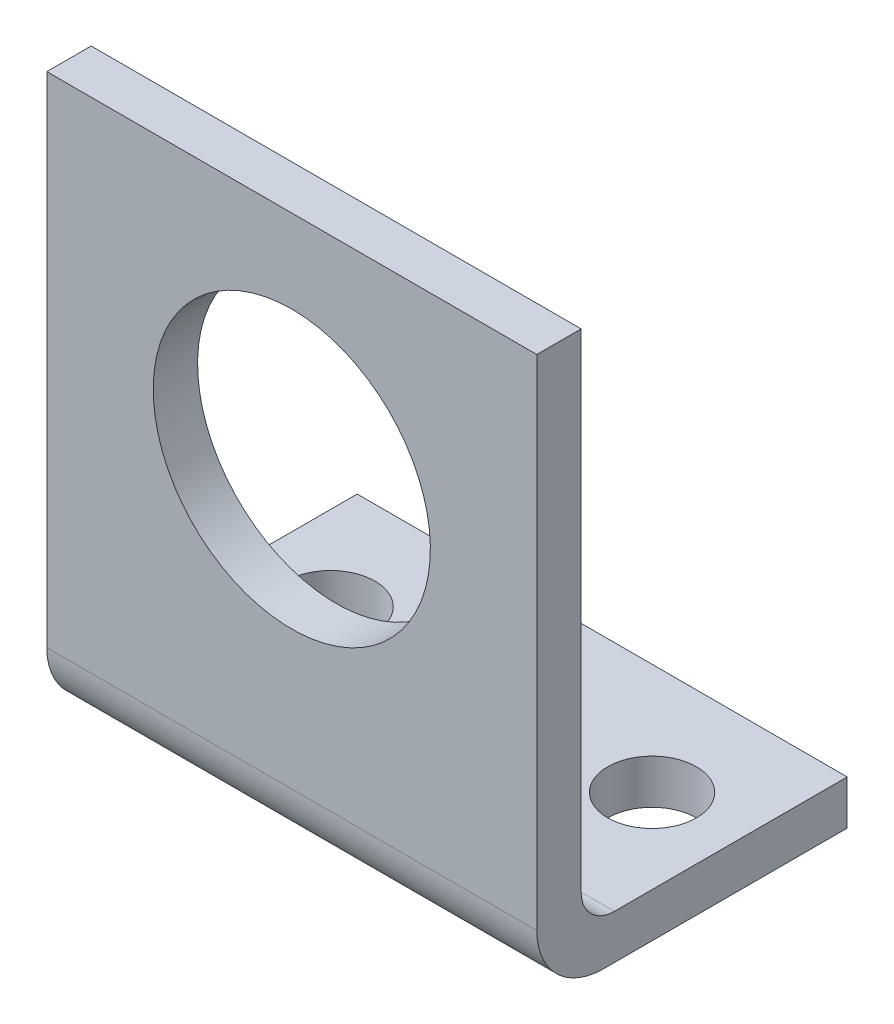
ISO-10303-21;
HEADER;
FILE_DESCRIPTION(('STEP AP214'),'2;1');
FILE_NAME('part.step','',(''),(''),'','','');
FILE_SCHEMA(('AUTOMOTIVE_DESIGN { 1 0 10303 214 1 1 1 1 }'));
ENDSEC;
DATA;
#1=APPLICATION_CONTEXT('core data for automotive mechanical design processes');
#2=APPLICATION_PROTOCOL_DEFINITION('international standard','automotive_design',2000,#1);
#3=PRODUCT_CONTEXT('',#1,'mechanical');
#4=PRODUCT('Part','Part','',(#3));
#5=PRODUCT_RELATED_PRODUCT_CATEGORY('part','',(#4));
#6=PRODUCT_DEFINITION_FORMATION('','',#4);
#7=PRODUCT_DEFINITION_CONTEXT('part definition',#1,'design');
#8=PRODUCT_DEFINITION('design','',#6,#7);
#9=PRODUCT_DEFINITION_SHAPE('','',#8);
#10=(LENGTH_UNIT() NAMED_UNIT(*) SI_UNIT(.MILLI.,.METRE.));
#11=(NAMED_UNIT(*) PLANE_ANGLE_UNIT() SI_UNIT($,.RADIAN.));
#12=(NAMED_UNIT(*) SI_UNIT($,.STERADIAN.) SOLID_ANGLE_UNIT());
#13=UNCERTAINTY_MEASURE_WITH_UNIT(LENGTH_MEASURE(1.E-05),#10,'distance_accuracy_value','');
#14=(GEOMETRIC_REPRESENTATION_CONTEXT(3) GLOBAL_UNCERTAINTY_ASSIGNED_CONTEXT((#13)) GLOBAL_UNIT_ASSIGNED_CONTEXT((#10,
#11,#12)) REPRESENTATION_CONTEXT('',''));
#15=CARTESIAN_POINT('',(0.,0.,0.));
#16=DIRECTION('',(0.,0.,1.));
#17=DIRECTION('',(1.,0.,0.));
#18=AXIS2_PLACEMENT_3D('',#15,#16,#17);
#19=CARTESIAN_POINT('',(22.1,25.5,0.));
#20=DIRECTION('',(0.,-1.,0.));
#21=DIRECTION('',(0.,0.,-1.));
#22=AXIS2_PLACEMENT_3D('',#19,#20,#21);
#23=PLANE('',#22);
#24=DIRECTION('',(0.,0.,1.));
#25=VECTOR('',#24,1.);
#26=CARTESIAN_POINT('',(0.,25.5,0.));
#27=LINE('',#26,#25);
#28=CARTESIAN_POINT('',(0.,25.5,-2.));
#29=VERTEX_POINT('',#28);
#30=CARTESIAN_POINT('',(0.,25.5,0.));
#31=VERTEX_POINT('',#30);
#32=EDGE_CURVE('E128',#29,#31,#27,.T.);
#33=ORIENTED_EDGE('',*,*,#32,.T.);
#34=DIRECTION('',(-1.,0.,0.));
#35=VECTOR('',#34,1.);
#36=CARTESIAN_POINT('',(22.1,25.5,0.));
#37=LINE('',#36,#35);
#38=CARTESIAN_POINT('',(22.1,25.5,0.));
#39=VERTEX_POINT('',#38);
#40=EDGE_CURVE('E11',#39,#31,#37,.T.);
#41=ORIENTED_EDGE('',*,*,#40,.F.);
#42=DIRECTION('',(0.,0.,1.));
#43=VECTOR('',#42,1.);
#44=CARTESIAN_POINT('',(22.1,25.5,0.));
#45=LINE('',#44,#43);
#46=CARTESIAN_POINT('',(22.1,25.5,-2.));
#47=VERTEX_POINT('',#46);
#48=EDGE_CURVE('E143',#47,#39,#45,.T.);
#49=ORIENTED_EDGE('',*,*,#48,.F.);
#50=DIRECTION('',(-1.,0.,0.));
#51=VECTOR('',#50,1.);
#52=CARTESIAN_POINT('',(22.1,25.5,-2.));
#53=LINE('',#52,#51);
#54=EDGE_CURVE('E124',#47,#29,#53,.T.);
#55=ORIENTED_EDGE('',*,*,#54,.T.);
#56=EDGE_LOOP('',(#33,#41,#49,#55));
#57=FACE_BOUND('',#56,.T.);
#58=ADVANCED_FACE('F32',(#57),#23,.F.);
#59=CARTESIAN_POINT('',(22.1,25.5,0.));
#60=DIRECTION('',(0.,0.,-1.));
#61=DIRECTION('',(0.,1.,0.));
#62=AXIS2_PLACEMENT_3D('',#59,#60,#61);
#63=PLANE('',#62);
#64=CARTESIAN_POINT('',(11.05,15.5,0.));
#65=DIRECTION('',(0.,0.,-1.));
#66=DIRECTION('',(0.,1.,0.));
#67=AXIS2_PLACEMENT_3D('',#64,#65,#66);
#68=CIRCLE('',#67,6.25);
#69=CARTESIAN_POINT('',(11.05,21.75,0.));
#70=VERTEX_POINT('',#69);
#71=EDGE_CURVE('E185',#70,#70,#68,.T.);
#72=ORIENTED_EDGE('',*,*,#71,.T.);
#73=EDGE_LOOP('',(#72));
#74=FACE_BOUND('',#73,.T.);
#75=DIRECTION('',(0.,-1.,0.));
#76=VECTOR('',#75,1.);
#77=CARTESIAN_POINT('',(0.,25.5,0.));
#78=LINE('',#77,#76);
#79=CARTESIAN_POINT('',(0.,3.,0.));
#80=VERTEX_POINT('',#79);
#81=EDGE_CURVE('E131',#31,#80,#78,.T.);
#82=ORIENTED_EDGE('',*,*,#81,.T.);
#83=DIRECTION('',(-1.,0.,0.));
#84=VECTOR('',#83,1.);
#85=CARTESIAN_POINT('',(22.1,3.,0.));
#86=LINE('',#85,#84);
#87=CARTESIAN_POINT('',(22.1,3.,0.));
#88=VERTEX_POINT('',#87);
#89=EDGE_CURVE('E40',#88,#80,#86,.T.);
#90=ORIENTED_EDGE('',*,*,#89,.F.);
#91=DIRECTION('',(0.,-1.,0.));
#92=VECTOR('',#91,1.);
#93=CARTESIAN_POINT('',(22.1,25.5,0.));
#94=LINE('',#93,#92);
#95=EDGE_CURVE('E91',#39,#88,#94,.T.);
#96=ORIENTED_EDGE('',*,*,#95,.F.);
#97=ORIENTED_EDGE('',*,*,#40,.T.);
#98=EDGE_LOOP('',(#82,#90,#96,#97));
#99=FACE_BOUND('',#98,.T.);
#100=ADVANCED_FACE('F194',(#74,#99),#63,.F.);
#101=CARTESIAN_POINT('',(22.1,3.,-3.));
#102=DIRECTION('',(-1.,0.,0.));
#103=DIRECTION('',(0.,0.,1.));
#104=AXIS2_PLACEMENT_3D('',#101,#102,#103);
#105=CYLINDRICAL_SURFACE('',#104,3.);
#106=CARTESIAN_POINT('',(0.,3.,-3.));
#107=DIRECTION('',(1.,0.,0.));
#108=DIRECTION('',(0.,0.,-1.));
#109=AXIS2_PLACEMENT_3D('',#106,#107,#108);
#110=CIRCLE('',#109,3.);
#111=CARTESIAN_POINT('',(0.,0.,-3.));
#112=VERTEX_POINT('',#111);
#113=EDGE_CURVE('E134',#80,#112,#110,.T.);
#114=ORIENTED_EDGE('',*,*,#113,.T.);
#115=DIRECTION('',(-1.,0.,0.));
#116=VECTOR('',#115,1.);
#117=CARTESIAN_POINT('',(22.1,0.,-3.));
#118=LINE('',#117,#116);
#119=CARTESIAN_POINT('',(22.1,0.,-3.));
#120=VERTEX_POINT('',#119);
#121=EDGE_CURVE('E150',#120,#112,#118,.T.);
#122=ORIENTED_EDGE('',*,*,#121,.F.);
#123=CARTESIAN_POINT('',(22.1,3.,-3.));
#124=DIRECTION('',(1.,0.,0.));
#125=DIRECTION('',(0.,0.,-1.));
#126=AXIS2_PLACEMENT_3D('',#123,#124,#125);
#127=CIRCLE('',#126,3.);
#128=EDGE_CURVE('E158',#88,#120,#127,.T.);
#129=ORIENTED_EDGE('',*,*,#128,.F.);
#130=ORIENTED_EDGE('',*,*,#89,.T.);
#131=EDGE_LOOP('',(#114,#122,#129,#130));
#132=FACE_BOUND('',#131,.T.);
#133=ADVANCED_FACE('F156',(#132),#105,.T.);
#134=CARTESIAN_POINT('',(22.1,0.,-3.));
#135=DIRECTION('',(0.,1.,0.));
#136=DIRECTION('',(0.,0.,1.));
#137=AXIS2_PLACEMENT_3D('',#134,#135,#136);
#138=PLANE('',#137);
#139=CARTESIAN_POINT('',(18.3,0.,-9.));
#140=DIRECTION('',(0.,1.,0.));
#141=DIRECTION('',(0.,0.,1.));
#142=AXIS2_PLACEMENT_3D('',#139,#140,#141);
#143=CIRCLE('',#142,2.);
#144=CARTESIAN_POINT('',(18.3,0.,-7.));
#145=VERTEX_POINT('',#144);
#146=EDGE_CURVE('E179',#145,#145,#143,.T.);
#147=ORIENTED_EDGE('',*,*,#146,.T.);
#148=EDGE_LOOP('',(#147));
#149=FACE_BOUND('',#148,.T.);
#150=CARTESIAN_POINT('',(3.8,0.,-9.));
#151=DIRECTION('',(0.,1.,0.));
#152=DIRECTION('',(0.,0.,1.));
#153=AXIS2_PLACEMENT_3D('',#150,#151,#152);
#154=CIRCLE('',#153,2.);
#155=CARTESIAN_POINT('',(3.8,0.,-7.));
#156=VERTEX_POINT('',#155);
#157=EDGE_CURVE('E132',#156,#156,#154,.T.);
#158=ORIENTED_EDGE('',*,*,#157,.T.);
#159=EDGE_LOOP('',(#158));
#160=FACE_BOUND('',#159,.T.);
#161=DIRECTION('',(0.,0.,-1.));
#162=VECTOR('',#161,1.);
#163=CARTESIAN_POINT('',(0.,0.,-3.));
#164=LINE('',#163,#162);
#165=CARTESIAN_POINT('',(0.,0.,-14.));
#166=VERTEX_POINT('',#165);
#167=EDGE_CURVE('E136',#112,#166,#164,.T.);
#168=ORIENTED_EDGE('',*,*,#167,.T.);
#169=DIRECTION('',(-1.,0.,0.));
#170=VECTOR('',#169,1.);
#171=CARTESIAN_POINT('',(22.1,0.,-14.));
#172=LINE('',#171,#170);
#173=CARTESIAN_POINT('',(22.1,0.,-14.));
#174=VERTEX_POINT('',#173);
#175=EDGE_CURVE('E147',#174,#166,#172,.T.);
#176=ORIENTED_EDGE('',*,*,#175,.F.);
#177=DIRECTION('',(0.,0.,-1.));
#178=VECTOR('',#177,1.);
#179=CARTESIAN_POINT('',(22.1,0.,-3.));
#180=LINE('',#179,#178);
#181=EDGE_CURVE('E170',#120,#174,#180,.T.);
#182=ORIENTED_EDGE('',*,*,#181,.F.);
#183=ORIENTED_EDGE('',*,*,#121,.T.);
#184=EDGE_LOOP('',(#168,#176,#182,#183));
#185=FACE_BOUND('',#184,.T.);
#186=ADVANCED_FACE('F166',(#149,#160,#185),#138,.F.);
#187=CARTESIAN_POINT('',(22.1,2.,-14.));
#188=DIRECTION('',(0.,0.,1.));
#189=DIRECTION('',(1.,0.,0.));
#190=AXIS2_PLACEMENT_3D('',#187,#188,#189);
#191=PLANE('',#190);
#192=DIRECTION('',(0.,1.,0.));
#193=VECTOR('',#192,1.);
#194=CARTESIAN_POINT('',(0.,2.,-14.));
#195=LINE('',#194,#193);
#196=CARTESIAN_POINT('',(0.,2.,-14.));
#197=VERTEX_POINT('',#196);
#198=EDGE_CURVE('E138',#166,#197,#195,.T.);
#199=ORIENTED_EDGE('',*,*,#198,.T.);
#200=DIRECTION('',(-1.,0.,0.));
#201=VECTOR('',#200,1.);
#202=CARTESIAN_POINT('',(22.1,2.,-14.));
#203=LINE('',#202,#201);
#204=CARTESIAN_POINT('',(22.1,2.,-14.));
#205=VERTEX_POINT('',#204);
#206=EDGE_CURVE('E119',#205,#197,#203,.T.);
#207=ORIENTED_EDGE('',*,*,#206,.F.);
#208=DIRECTION('',(0.,1.,0.));
#209=VECTOR('',#208,1.);
#210=CARTESIAN_POINT('',(22.1,2.,-14.));
#211=LINE('',#210,#209);
#212=EDGE_CURVE('E110',#174,#205,#211,.T.);
#213=ORIENTED_EDGE('',*,*,#212,.F.);
#214=ORIENTED_EDGE('',*,*,#175,.T.);
#215=EDGE_LOOP('',(#199,#207,#213,#214));
#216=FACE_BOUND('',#215,.T.);
#217=ADVANCED_FACE('F169',(#216),#191,.F.);
#218=CARTESIAN_POINT('',(22.1,2.,-3.50000000000001));
#219=DIRECTION('',(0.,-1.,0.));
#220=DIRECTION('',(0.,0.,-1.));
#221=AXIS2_PLACEMENT_3D('',#218,#219,#220);
#222=PLANE('',#221);
#223=CARTESIAN_POINT('',(18.3,2.,-9.));
#224=DIRECTION('',(0.,1.,0.));
#225=DIRECTION('',(0.,0.,1.));
#226=AXIS2_PLACEMENT_3D('',#223,#224,#225);
#227=CIRCLE('',#226,2.);
#228=CARTESIAN_POINT('',(18.3,2.,-7.));
#229=VERTEX_POINT('',#228);
#230=EDGE_CURVE('E182',#229,#229,#227,.T.);
#231=ORIENTED_EDGE('',*,*,#230,.F.);
#232=EDGE_LOOP('',(#231));
#233=FACE_BOUND('',#232,.T.);
#234=CARTESIAN_POINT('',(3.8,2.,-9.));
#235=DIRECTION('',(0.,1.,0.));
#236=DIRECTION('',(0.,0.,1.));
#237=AXIS2_PLACEMENT_3D('',#234,#235,#236);
#238=CIRCLE('',#237,2.);
#239=CARTESIAN_POINT('',(3.8,2.,-7.));
#240=VERTEX_POINT('',#239);
#241=EDGE_CURVE('E176',#240,#240,#238,.T.);
#242=ORIENTED_EDGE('',*,*,#241,.F.);
#243=EDGE_LOOP('',(#242));
#244=FACE_BOUND('',#243,.T.);
#245=DIRECTION('',(0.,0.,1.));
#246=VECTOR('',#245,1.);
#247=CARTESIAN_POINT('',(0.,2.,-3.50000000000001));
#248=LINE('',#247,#246);
#249=CARTESIAN_POINT('',(0.,2.,-3.50000000000001));
#250=VERTEX_POINT('',#249);
#251=EDGE_CURVE('E118',#197,#250,#248,.T.);
#252=ORIENTED_EDGE('',*,*,#251,.T.);
#253=DIRECTION('',(-1.,0.,0.));
#254=VECTOR('',#253,1.);
#255=CARTESIAN_POINT('',(22.1,2.,-3.50000000000001));
#256=LINE('',#255,#254);
#257=CARTESIAN_POINT('',(22.1,2.,-3.50000000000001));
#258=VERTEX_POINT('',#257);
#259=EDGE_CURVE('E115',#258,#250,#256,.T.);
#260=ORIENTED_EDGE('',*,*,#259,.F.);
#261=DIRECTION('',(0.,0.,1.));
#262=VECTOR('',#261,1.);
#263=CARTESIAN_POINT('',(22.1,2.,-3.50000000000001));
#264=LINE('',#263,#262);
#265=EDGE_CURVE('E104',#205,#258,#264,.T.);
#266=ORIENTED_EDGE('',*,*,#265,.F.);
#267=ORIENTED_EDGE('',*,*,#206,.T.);
#268=EDGE_LOOP('',(#252,#260,#266,#267));
#269=FACE_BOUND('',#268,.T.);
#270=ADVANCED_FACE('F116',(#233,#244,#269),#222,.F.);
#271=CARTESIAN_POINT('',(22.1,3.5,-3.5));
#272=DIRECTION('',(-1.,0.,0.));
#273=DIRECTION('',(0.,0.,1.));
#274=AXIS2_PLACEMENT_3D('',#271,#272,#273);
#275=CYLINDRICAL_SURFACE('',#274,1.5);
#276=CARTESIAN_POINT('',(0.,3.5,-3.5));
#277=DIRECTION('',(-1.,0.,0.));
#278=DIRECTION('',(0.,0.,-1.));
#279=AXIS2_PLACEMENT_3D('',#276,#277,#278);
#280=CIRCLE('',#279,1.5);
#281=CARTESIAN_POINT('',(0.,3.50000000000001,-2.));
#282=VERTEX_POINT('',#281);
#283=EDGE_CURVE('E77',#250,#282,#280,.T.);
#284=ORIENTED_EDGE('',*,*,#283,.T.);
#285=DIRECTION('',(-1.,0.,0.));
#286=VECTOR('',#285,1.);
#287=CARTESIAN_POINT('',(22.1,3.50000000000001,-2.));
#288=LINE('',#287,#286);
#289=CARTESIAN_POINT('',(22.1,3.50000000000001,-2.));
#290=VERTEX_POINT('',#289);
#291=EDGE_CURVE('E120',#290,#282,#288,.T.);
#292=ORIENTED_EDGE('',*,*,#291,.F.);
#293=CARTESIAN_POINT('',(22.1,3.5,-3.5));
#294=DIRECTION('',(-1.,0.,0.));
#295=DIRECTION('',(0.,0.,-1.));
#296=AXIS2_PLACEMENT_3D('',#293,#294,#295);
#297=CIRCLE('',#296,1.5);
#298=EDGE_CURVE('E108',#258,#290,#297,.T.);
#299=ORIENTED_EDGE('',*,*,#298,.F.);
#300=ORIENTED_EDGE('',*,*,#259,.T.);
#301=EDGE_LOOP('',(#284,#292,#299,#300));
#302=FACE_BOUND('',#301,.T.);
#303=ADVANCED_FACE('F122',(#302),#275,.F.);
#304=CARTESIAN_POINT('',(22.1,25.5,-2.));
#305=DIRECTION('',(0.,0.,1.));
#306=DIRECTION('',(0.,-1.,0.));
#307=AXIS2_PLACEMENT_3D('',#304,#305,#306);
#308=PLANE('',#307);
#309=CARTESIAN_POINT('',(11.05,15.5,-2.));
#310=DIRECTION('',(0.,0.,-1.));
#311=DIRECTION('',(0.,1.,0.));
#312=AXIS2_PLACEMENT_3D('',#309,#310,#311);
#313=CIRCLE('',#312,6.25);
#314=CARTESIAN_POINT('',(11.05,21.75,-2.));
#315=VERTEX_POINT('',#314);
#316=EDGE_CURVE('E188',#315,#315,#313,.T.);
#317=ORIENTED_EDGE('',*,*,#316,.F.);
#318=EDGE_LOOP('',(#317));
#319=FACE_BOUND('',#318,.T.);
#320=DIRECTION('',(0.,1.,0.));
#321=VECTOR('',#320,1.);
#322=CARTESIAN_POINT('',(0.,25.5,-2.));
#323=LINE('',#322,#321);
#324=EDGE_CURVE('E83',#282,#29,#323,.T.);
#325=ORIENTED_EDGE('',*,*,#324,.T.);
#326=ORIENTED_EDGE('',*,*,#54,.F.);
#327=DIRECTION('',(0.,1.,0.));
#328=VECTOR('',#327,1.);
#329=CARTESIAN_POINT('',(22.1,25.5,-2.));
#330=LINE('',#329,#328);
#331=EDGE_CURVE('E48',#290,#47,#330,.T.);
#332=ORIENTED_EDGE('',*,*,#331,.F.);
#333=ORIENTED_EDGE('',*,*,#291,.T.);
#334=EDGE_LOOP('',(#325,#326,#332,#333));
#335=FACE_BOUND('',#334,.T.);
#336=ADVANCED_FACE('F203',(#319,#335),#308,.F.);
#337=CARTESIAN_POINT('',(22.1,3.5,-3.5));
#338=DIRECTION('',(1.,0.,0.));
#339=DIRECTION('',(0.,0.,-1.));
#340=AXIS2_PLACEMENT_3D('',#337,#338,#339);
#341=PLANE('',#340);
#342=ORIENTED_EDGE('',*,*,#48,.T.);
#343=ORIENTED_EDGE('',*,*,#95,.T.);
#344=ORIENTED_EDGE('',*,*,#128,.T.);
#345=ORIENTED_EDGE('',*,*,#181,.T.);
#346=ORIENTED_EDGE('',*,*,#212,.T.);
#347=ORIENTED_EDGE('',*,*,#265,.T.);
#348=ORIENTED_EDGE('',*,*,#298,.T.);
#349=ORIENTED_EDGE('',*,*,#331,.T.);
#350=EDGE_LOOP('',(#342,#343,#344,#345,#346,#347,#348,#349));
#351=FACE_BOUND('',#350,.T.);
#352=ADVANCED_FACE('F106',(#351),#341,.T.);
#353=CARTESIAN_POINT('',(0.,3.5,-3.5));
#354=DIRECTION('',(1.,0.,0.));
#355=DIRECTION('',(0.,0.,-1.));
#356=AXIS2_PLACEMENT_3D('',#353,#354,#355);
#357=PLANE('',#356);
#358=ORIENTED_EDGE('',*,*,#32,.F.);
#359=ORIENTED_EDGE('',*,*,#324,.F.);
#360=ORIENTED_EDGE('',*,*,#283,.F.);
#361=ORIENTED_EDGE('',*,*,#251,.F.);
#362=ORIENTED_EDGE('',*,*,#198,.F.);
#363=ORIENTED_EDGE('',*,*,#167,.F.);
#364=ORIENTED_EDGE('',*,*,#113,.F.);
#365=ORIENTED_EDGE('',*,*,#81,.F.);
#366=EDGE_LOOP('',(#358,#359,#360,#361,#362,#363,#364,#365));
#367=FACE_BOUND('',#366,.T.);
#368=ADVANCED_FACE('F162',(#367),#357,.F.);
#369=CARTESIAN_POINT('',(3.8,0.,-9.));
#370=DIRECTION('',(0.,1.,0.));
#371=DIRECTION('',(0.,0.,1.));
#372=AXIS2_PLACEMENT_3D('',#369,#370,#371);
#373=CYLINDRICAL_SURFACE('',#372,2.);
#374=ORIENTED_EDGE('',*,*,#157,.F.);
#375=EDGE_LOOP('',(#374));
#376=FACE_BOUND('',#375,.T.);
#377=ORIENTED_EDGE('',*,*,#241,.T.);
#378=EDGE_LOOP('',(#377));
#379=FACE_BOUND('',#378,.T.);
#380=ADVANCED_FACE('F238',(#376,#379),#373,.F.);
#381=CARTESIAN_POINT('',(18.3,0.,-9.));
#382=DIRECTION('',(0.,1.,0.));
#383=DIRECTION('',(0.,0.,1.));
#384=AXIS2_PLACEMENT_3D('',#381,#382,#383);
#385=CYLINDRICAL_SURFACE('',#384,2.);
#386=ORIENTED_EDGE('',*,*,#146,.F.);
#387=EDGE_LOOP('',(#386));
#388=FACE_BOUND('',#387,.T.);
#389=ORIENTED_EDGE('',*,*,#230,.T.);
#390=EDGE_LOOP('',(#389));
#391=FACE_BOUND('',#390,.T.);
#392=ADVANCED_FACE('F199',(#388,#391),#385,.F.);
#393=CARTESIAN_POINT('',(11.05,15.5,0.));
#394=DIRECTION('',(0.,0.,-1.));
#395=DIRECTION('',(0.,1.,0.));
#396=AXIS2_PLACEMENT_3D('',#393,#394,#395);
#397=CYLINDRICAL_SURFACE('',#396,6.25);
#398=ORIENTED_EDGE('',*,*,#71,.F.);
#399=EDGE_LOOP('',(#398));
#400=FACE_BOUND('',#399,.T.);
#401=ORIENTED_EDGE('',*,*,#316,.T.);
#402=EDGE_LOOP('',(#401));
#403=FACE_BOUND('',#402,.T.);
#404=ADVANCED_FACE('F196',(#400,#403),#397,.F.);
#405=CLOSED_SHELL('',(#58,#100,#133,#186,#217,#270,#303,#336,#352,#368,#380,#392,#404));
#406=MANIFOLD_SOLID_BREP('B2',#405);
#407=ADVANCED_BREP_SHAPE_REPRESENTATION('',(#18,#406),#14);
#408=SHAPE_DEFINITION_REPRESENTATION(#9,#407);
ENDSEC;
END-ISO-10303-21;
